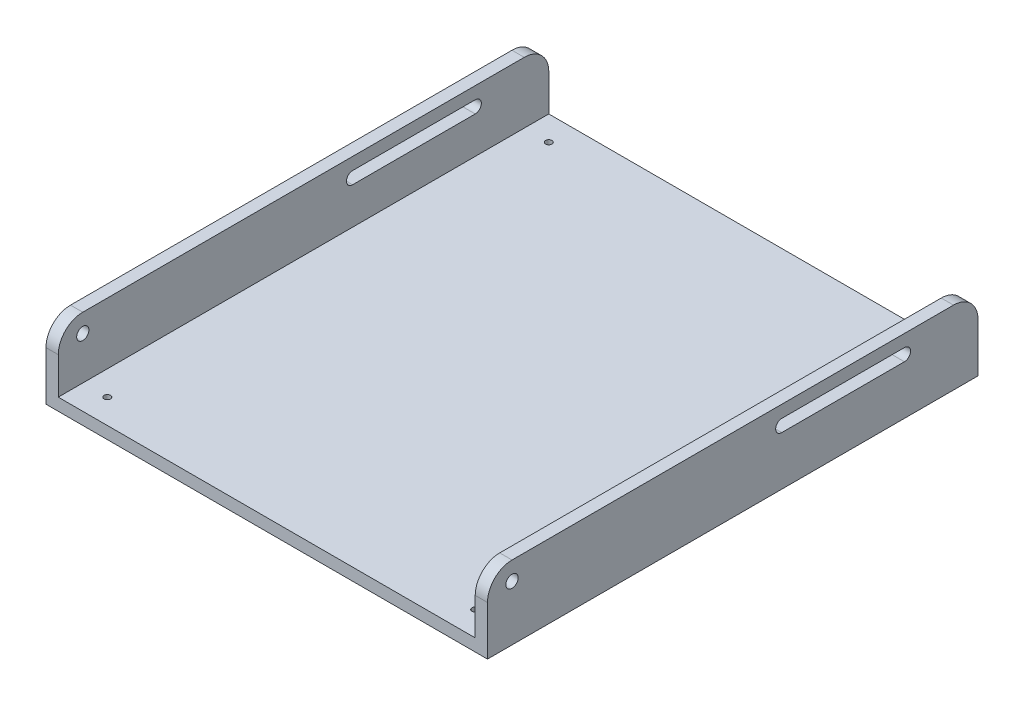
ISO-10303-21;
HEADER;
FILE_DESCRIPTION(('STEP AP214'),'2;1');
FILE_NAME('part.step','',(''),(''),'','','');
FILE_SCHEMA(('AUTOMOTIVE_DESIGN { 1 0 10303 214 1 1 1 1 }'));
ENDSEC;
DATA;
#1=APPLICATION_CONTEXT('core data for automotive mechanical design processes');
#2=APPLICATION_PROTOCOL_DEFINITION('international standard','automotive_design',2000,#1);
#3=PRODUCT_CONTEXT('',#1,'mechanical');
#4=PRODUCT('Part','Part','',(#3));
#5=PRODUCT_RELATED_PRODUCT_CATEGORY('part','',(#4));
#6=PRODUCT_DEFINITION_FORMATION('','',#4);
#7=PRODUCT_DEFINITION_CONTEXT('part definition',#1,'design');
#8=PRODUCT_DEFINITION('design','',#6,#7);
#9=PRODUCT_DEFINITION_SHAPE('','',#8);
#10=(LENGTH_UNIT() NAMED_UNIT(*) SI_UNIT(.MILLI.,.METRE.));
#11=(NAMED_UNIT(*) PLANE_ANGLE_UNIT() SI_UNIT($,.RADIAN.));
#12=(NAMED_UNIT(*) SI_UNIT($,.STERADIAN.) SOLID_ANGLE_UNIT());
#13=UNCERTAINTY_MEASURE_WITH_UNIT(LENGTH_MEASURE(1.E-05),#10,'distance_accuracy_value','');
#14=(GEOMETRIC_REPRESENTATION_CONTEXT(3) GLOBAL_UNCERTAINTY_ASSIGNED_CONTEXT((#13)) GLOBAL_UNIT_ASSIGNED_CONTEXT((#10,
#11,#12)) REPRESENTATION_CONTEXT('',''));
#15=CARTESIAN_POINT('',(0.,0.,0.));
#16=DIRECTION('',(0.,0.,1.));
#17=DIRECTION('',(1.,0.,0.));
#18=AXIS2_PLACEMENT_3D('',#15,#16,#17);
#19=CARTESIAN_POINT('',(-140.,0.,200.));
#20=DIRECTION('',(-1.,0.,0.));
#21=DIRECTION('',(0.,0.,1.));
#22=AXIS2_PLACEMENT_3D('',#19,#20,#21);
#23=PLANE('',#22);
#24=CARTESIAN_POINT('',(-140.,45.,180.));
#25=DIRECTION('',(-1.,0.,0.));
#26=DIRECTION('',(0.,0.,1.));
#27=AXIS2_PLACEMENT_3D('',#24,#25,#26);
#28=CIRCLE('',#27,4.99999999999999);
#29=CARTESIAN_POINT('',(-140.,45.,185.));
#30=VERTEX_POINT('',#29);
#31=EDGE_CURVE('E299',#30,#30,#28,.T.);
#32=ORIENTED_EDGE('',*,*,#31,.T.);
#33=EDGE_LOOP('',(#32));
#34=FACE_BOUND('',#33,.T.);
#35=DIRECTION('',(0.,0.,1.));
#36=VECTOR('',#35,1.);
#37=CARTESIAN_POINT('',(-140.,40.,200.));
#38=LINE('',#37,#36);
#39=CARTESIAN_POINT('',(-140.,40.,-140.));
#40=VERTEX_POINT('',#39);
#41=CARTESIAN_POINT('',(-140.,40.,-40.));
#42=VERTEX_POINT('',#41);
#43=EDGE_CURVE('E216',#40,#42,#38,.T.);
#44=ORIENTED_EDGE('',*,*,#43,.T.);
#45=CARTESIAN_POINT('',(-140.,45.,-40.));
#46=DIRECTION('',(-1.,0.,0.));
#47=DIRECTION('',(0.,0.,1.));
#48=AXIS2_PLACEMENT_3D('',#45,#46,#47);
#49=CIRCLE('',#48,5.);
#50=CARTESIAN_POINT('',(-140.,50.,-40.));
#51=VERTEX_POINT('',#50);
#52=EDGE_CURVE('E232',#42,#51,#49,.T.);
#53=ORIENTED_EDGE('',*,*,#52,.T.);
#54=DIRECTION('',(0.,0.,-1.));
#55=VECTOR('',#54,1.);
#56=CARTESIAN_POINT('',(-140.,50.,200.));
#57=LINE('',#56,#55);
#58=CARTESIAN_POINT('',(-140.,50.,-140.));
#59=VERTEX_POINT('',#58);
#60=EDGE_CURVE('E227',#51,#59,#57,.T.);
#61=ORIENTED_EDGE('',*,*,#60,.T.);
#62=CARTESIAN_POINT('',(-140.,45.,-140.));
#63=DIRECTION('',(-1.,0.,0.));
#64=DIRECTION('',(0.,0.,1.));
#65=AXIS2_PLACEMENT_3D('',#62,#63,#64);
#66=CIRCLE('',#65,4.99999999999999);
#67=EDGE_CURVE('E222',#59,#40,#66,.T.);
#68=ORIENTED_EDGE('',*,*,#67,.T.);
#69=EDGE_LOOP('',(#44,#53,#61,#68));
#70=FACE_BOUND('',#69,.T.);
#71=DIRECTION('',(0.,0.,-1.));
#72=VECTOR('',#71,1.);
#73=CARTESIAN_POINT('',(-140.,60.,200.));
#74=LINE('',#73,#72);
#75=CARTESIAN_POINT('',(-140.,60.,180.));
#76=VERTEX_POINT('',#75);
#77=CARTESIAN_POINT('',(-140.,60.,-180.));
#78=VERTEX_POINT('',#77);
#79=EDGE_CURVE('E283',#76,#78,#74,.T.);
#80=ORIENTED_EDGE('',*,*,#79,.F.);
#81=CARTESIAN_POINT('',(-140.,40.,180.));
#82=DIRECTION('',(-1.,0.,0.));
#83=DIRECTION('',(0.,0.,1.));
#84=AXIS2_PLACEMENT_3D('',#81,#82,#83);
#85=CIRCLE('',#84,20.);
#86=CARTESIAN_POINT('',(-140.,40.,200.));
#87=VERTEX_POINT('',#86);
#88=EDGE_CURVE('E323',#76,#87,#85,.F.);
#89=ORIENTED_EDGE('',*,*,#88,.T.);
#90=DIRECTION('',(0.,1.,0.));
#91=VECTOR('',#90,1.);
#92=CARTESIAN_POINT('',(-140.,0.,200.));
#93=LINE('',#92,#91);
#94=CARTESIAN_POINT('',(-140.,10.,200.));
#95=VERTEX_POINT('',#94);
#96=EDGE_CURVE('E236',#95,#87,#93,.T.);
#97=ORIENTED_EDGE('',*,*,#96,.F.);
#98=DIRECTION('',(0.,0.,-1.));
#99=VECTOR('',#98,1.);
#100=CARTESIAN_POINT('',(-140.,10.,200.));
#101=LINE('',#100,#99);
#102=CARTESIAN_POINT('',(-140.,10.,-200.));
#103=VERTEX_POINT('',#102);
#104=EDGE_CURVE('E252',#95,#103,#101,.T.);
#105=ORIENTED_EDGE('',*,*,#104,.T.);
#106=DIRECTION('',(0.,1.,0.));
#107=VECTOR('',#106,1.);
#108=CARTESIAN_POINT('',(-140.,0.,-200.));
#109=LINE('',#108,#107);
#110=CARTESIAN_POINT('',(-140.,40.,-200.));
#111=VERTEX_POINT('',#110);
#112=EDGE_CURVE('E235',#103,#111,#109,.T.);
#113=ORIENTED_EDGE('',*,*,#112,.T.);
#114=CARTESIAN_POINT('',(-140.,40.,-180.));
#115=DIRECTION('',(-1.,0.,0.));
#116=DIRECTION('',(0.,0.,1.));
#117=AXIS2_PLACEMENT_3D('',#114,#115,#116);
#118=CIRCLE('',#117,20.);
#119=EDGE_CURVE('E59',#111,#78,#118,.F.);
#120=ORIENTED_EDGE('',*,*,#119,.T.);
#121=EDGE_LOOP('',(#80,#89,#97,#105,#113,#120));
#122=FACE_BOUND('',#121,.T.);
#123=ADVANCED_FACE('F36',(#34,#70,#122),#23,.F.);
#124=CARTESIAN_POINT('',(-150.,60.,200.));
#125=DIRECTION('',(0.,1.,0.));
#126=DIRECTION('',(0.,0.,1.));
#127=AXIS2_PLACEMENT_3D('',#124,#125,#126);
#128=PLANE('',#127);
#129=DIRECTION('',(0.,0.,-1.));
#130=VECTOR('',#129,1.);
#131=CARTESIAN_POINT('',(-150.,60.,200.));
#132=LINE('',#131,#130);
#133=CARTESIAN_POINT('',(-150.,60.,180.));
#134=VERTEX_POINT('',#133);
#135=CARTESIAN_POINT('',(-150.,60.,-180.));
#136=VERTEX_POINT('',#135);
#137=EDGE_CURVE('E281',#134,#136,#132,.T.);
#138=ORIENTED_EDGE('',*,*,#137,.F.);
#139=DIRECTION('',(1.,0.,0.));
#140=VECTOR('',#139,1.);
#141=CARTESIAN_POINT('',(-140.,60.,180.));
#142=LINE('',#141,#140);
#143=EDGE_CURVE('E319',#134,#76,#142,.T.);
#144=ORIENTED_EDGE('',*,*,#143,.T.);
#145=ORIENTED_EDGE('',*,*,#79,.T.);
#146=DIRECTION('',(1.,0.,0.));
#147=VECTOR('',#146,1.);
#148=CARTESIAN_POINT('',(-150.,60.,-180.));
#149=LINE('',#148,#147);
#150=EDGE_CURVE('E317',#78,#136,#149,.F.);
#151=ORIENTED_EDGE('',*,*,#150,.T.);
#152=EDGE_LOOP('',(#138,#144,#145,#151));
#153=FACE_BOUND('',#152,.T.);
#154=ADVANCED_FACE('F347',(#153),#128,.T.);
#155=CARTESIAN_POINT('',(-150.,0.,200.));
#156=DIRECTION('',(-1.,0.,0.));
#157=DIRECTION('',(0.,0.,1.));
#158=AXIS2_PLACEMENT_3D('',#155,#156,#157);
#159=PLANE('',#158);
#160=CARTESIAN_POINT('',(-150.,45.,180.));
#161=DIRECTION('',(-1.,0.,0.));
#162=DIRECTION('',(0.,0.,1.));
#163=AXIS2_PLACEMENT_3D('',#160,#161,#162);
#164=CIRCLE('',#163,4.99999999999999);
#165=CARTESIAN_POINT('',(-150.,45.,185.));
#166=VERTEX_POINT('',#165);
#167=EDGE_CURVE('E482',#166,#166,#164,.T.);
#168=ORIENTED_EDGE('',*,*,#167,.F.);
#169=EDGE_LOOP('',(#168));
#170=FACE_BOUND('',#169,.T.);
#171=CARTESIAN_POINT('',(-150.,45.,-40.));
#172=DIRECTION('',(-1.,0.,0.));
#173=DIRECTION('',(0.,0.,1.));
#174=AXIS2_PLACEMENT_3D('',#171,#172,#173);
#175=CIRCLE('',#174,5.);
#176=CARTESIAN_POINT('',(-150.,40.,-40.));
#177=VERTEX_POINT('',#176);
#178=CARTESIAN_POINT('',(-150.,50.,-40.));
#179=VERTEX_POINT('',#178);
#180=EDGE_CURVE('E230',#177,#179,#175,.T.);
#181=ORIENTED_EDGE('',*,*,#180,.F.);
#182=DIRECTION('',(0.,0.,1.));
#183=VECTOR('',#182,1.);
#184=CARTESIAN_POINT('',(-150.,40.,200.));
#185=LINE('',#184,#183);
#186=CARTESIAN_POINT('',(-150.,40.,-140.));
#187=VERTEX_POINT('',#186);
#188=EDGE_CURVE('E214',#187,#177,#185,.T.);
#189=ORIENTED_EDGE('',*,*,#188,.F.);
#190=CARTESIAN_POINT('',(-150.,45.,-140.));
#191=DIRECTION('',(-1.,0.,0.));
#192=DIRECTION('',(0.,0.,1.));
#193=AXIS2_PLACEMENT_3D('',#190,#191,#192);
#194=CIRCLE('',#193,4.99999999999999);
#195=CARTESIAN_POINT('',(-150.,50.,-140.));
#196=VERTEX_POINT('',#195);
#197=EDGE_CURVE('E219',#196,#187,#194,.T.);
#198=ORIENTED_EDGE('',*,*,#197,.F.);
#199=DIRECTION('',(0.,0.,-1.));
#200=VECTOR('',#199,1.);
#201=CARTESIAN_POINT('',(-150.,50.,200.));
#202=LINE('',#201,#200);
#203=EDGE_CURVE('E225',#179,#196,#202,.T.);
#204=ORIENTED_EDGE('',*,*,#203,.F.);
#205=EDGE_LOOP('',(#181,#189,#198,#204));
#206=FACE_BOUND('',#205,.T.);
#207=DIRECTION('',(0.,1.,0.));
#208=VECTOR('',#207,1.);
#209=CARTESIAN_POINT('',(-150.,0.,200.));
#210=LINE('',#209,#208);
#211=CARTESIAN_POINT('',(-150.,0.,200.));
#212=VERTEX_POINT('',#211);
#213=CARTESIAN_POINT('',(-150.,40.,200.));
#214=VERTEX_POINT('',#213);
#215=EDGE_CURVE('E239',#212,#214,#210,.T.);
#216=ORIENTED_EDGE('',*,*,#215,.T.);
#217=CARTESIAN_POINT('',(-150.,40.,180.));
#218=DIRECTION('',(-1.,0.,0.));
#219=DIRECTION('',(0.,0.,1.));
#220=AXIS2_PLACEMENT_3D('',#217,#218,#219);
#221=CIRCLE('',#220,20.);
#222=EDGE_CURVE('E326',#214,#134,#221,.T.);
#223=ORIENTED_EDGE('',*,*,#222,.T.);
#224=ORIENTED_EDGE('',*,*,#137,.T.);
#225=CARTESIAN_POINT('',(-150.,40.,-180.));
#226=DIRECTION('',(-1.,0.,0.));
#227=DIRECTION('',(0.,0.,1.));
#228=AXIS2_PLACEMENT_3D('',#225,#226,#227);
#229=CIRCLE('',#228,20.);
#230=CARTESIAN_POINT('',(-150.,40.,-200.));
#231=VERTEX_POINT('',#230);
#232=EDGE_CURVE('E51',#136,#231,#229,.T.);
#233=ORIENTED_EDGE('',*,*,#232,.T.);
#234=DIRECTION('',(0.,1.,0.));
#235=VECTOR('',#234,1.);
#236=CARTESIAN_POINT('',(-150.,0.,-200.));
#237=LINE('',#236,#235);
#238=CARTESIAN_POINT('',(-150.,0.,-200.));
#239=VERTEX_POINT('',#238);
#240=EDGE_CURVE('E255',#239,#231,#237,.T.);
#241=ORIENTED_EDGE('',*,*,#240,.F.);
#242=DIRECTION('',(0.,0.,-1.));
#243=VECTOR('',#242,1.);
#244=CARTESIAN_POINT('',(-150.,0.,200.));
#245=LINE('',#244,#243);
#246=EDGE_CURVE('E279',#212,#239,#245,.T.);
#247=ORIENTED_EDGE('',*,*,#246,.F.);
#248=EDGE_LOOP('',(#216,#223,#224,#233,#241,#247));
#249=FACE_BOUND('',#248,.T.);
#250=ADVANCED_FACE('F350',(#170,#206,#249),#159,.T.);
#251=CARTESIAN_POINT('',(-150.,0.,200.));
#252=DIRECTION('',(0.,-1.,0.));
#253=DIRECTION('',(0.,0.,-1.));
#254=AXIS2_PLACEMENT_3D('',#251,#252,#253);
#255=PLANE('',#254);
#256=CARTESIAN_POINT('',(-120.,0.,180.));
#257=DIRECTION('',(0.,-1.,0.));
#258=DIRECTION('',(0.,0.,-1.));
#259=AXIS2_PLACEMENT_3D('',#256,#257,#258);
#260=CIRCLE('',#259,2.59999999999999);
#261=CARTESIAN_POINT('',(-120.,0.,177.4));
#262=VERTEX_POINT('',#261);
#263=EDGE_CURVE('E457',#262,#262,#260,.T.);
#264=ORIENTED_EDGE('',*,*,#263,.F.);
#265=EDGE_LOOP('',(#264));
#266=FACE_BOUND('',#265,.T.);
#267=CARTESIAN_POINT('',(180.,0.,180.));
#268=DIRECTION('',(0.,-1.,0.));
#269=DIRECTION('',(0.,0.,-1.));
#270=AXIS2_PLACEMENT_3D('',#267,#268,#269);
#271=CIRCLE('',#270,2.59999999999999);
#272=CARTESIAN_POINT('',(180.,0.,177.4));
#273=VERTEX_POINT('',#272);
#274=EDGE_CURVE('E467',#273,#273,#271,.T.);
#275=ORIENTED_EDGE('',*,*,#274,.F.);
#276=EDGE_LOOP('',(#275));
#277=FACE_BOUND('',#276,.T.);
#278=CARTESIAN_POINT('',(180.,0.,-180.));
#279=DIRECTION('',(0.,-1.,0.));
#280=DIRECTION('',(0.,0.,-1.));
#281=AXIS2_PLACEMENT_3D('',#278,#279,#280);
#282=CIRCLE('',#281,2.59999999999999);
#283=CARTESIAN_POINT('',(180.,0.,-182.6));
#284=VERTEX_POINT('',#283);
#285=EDGE_CURVE('E473',#284,#284,#282,.T.);
#286=ORIENTED_EDGE('',*,*,#285,.F.);
#287=EDGE_LOOP('',(#286));
#288=FACE_BOUND('',#287,.T.);
#289=CARTESIAN_POINT('',(-120.,0.,-180.));
#290=DIRECTION('',(0.,-1.,0.));
#291=DIRECTION('',(0.,0.,-1.));
#292=AXIS2_PLACEMENT_3D('',#289,#290,#291);
#293=CIRCLE('',#292,2.59999999999999);
#294=CARTESIAN_POINT('',(-120.,0.,-182.6));
#295=VERTEX_POINT('',#294);
#296=EDGE_CURVE('E479',#295,#295,#293,.T.);
#297=ORIENTED_EDGE('',*,*,#296,.F.);
#298=EDGE_LOOP('',(#297));
#299=FACE_BOUND('',#298,.T.);
#300=DIRECTION('',(-1.,0.,0.));
#301=VECTOR('',#300,1.);
#302=CARTESIAN_POINT('',(-150.,0.,-200.));
#303=LINE('',#302,#301);
#304=CARTESIAN_POINT('',(210.,0.,-200.));
#305=VERTEX_POINT('',#304);
#306=EDGE_CURVE('E257',#305,#239,#303,.T.);
#307=ORIENTED_EDGE('',*,*,#306,.F.);
#308=DIRECTION('',(0.,0.,-1.));
#309=VECTOR('',#308,1.);
#310=CARTESIAN_POINT('',(210.,0.,200.));
#311=LINE('',#310,#309);
#312=CARTESIAN_POINT('',(210.,0.,200.));
#313=VERTEX_POINT('',#312);
#314=EDGE_CURVE('E276',#313,#305,#311,.T.);
#315=ORIENTED_EDGE('',*,*,#314,.F.);
#316=DIRECTION('',(-1.,0.,0.));
#317=VECTOR('',#316,1.);
#318=CARTESIAN_POINT('',(-150.,0.,200.));
#319=LINE('',#318,#317);
#320=EDGE_CURVE('E243',#313,#212,#319,.T.);
#321=ORIENTED_EDGE('',*,*,#320,.T.);
#322=ORIENTED_EDGE('',*,*,#246,.T.);
#323=EDGE_LOOP('',(#307,#315,#321,#322));
#324=FACE_BOUND('',#323,.T.);
#325=ADVANCED_FACE('F342',(#266,#277,#288,#299,#324),#255,.T.);
#326=CARTESIAN_POINT('',(210.,0.,200.));
#327=DIRECTION('',(1.,0.,0.));
#328=DIRECTION('',(0.,0.,-1.));
#329=AXIS2_PLACEMENT_3D('',#326,#327,#328);
#330=PLANE('',#329);
#331=CARTESIAN_POINT('',(210.,45.,180.));
#332=DIRECTION('',(-1.,0.,0.));
#333=DIRECTION('',(0.,0.,1.));
#334=AXIS2_PLACEMENT_3D('',#331,#332,#333);
#335=CIRCLE('',#334,4.99999999999999);
#336=CARTESIAN_POINT('',(210.,45.,185.));
#337=VERTEX_POINT('',#336);
#338=EDGE_CURVE('E300',#337,#337,#335,.T.);
#339=ORIENTED_EDGE('',*,*,#338,.T.);
#340=EDGE_LOOP('',(#339));
#341=FACE_BOUND('',#340,.T.);
#342=CARTESIAN_POINT('',(210.,45.,-40.));
#343=DIRECTION('',(1.,0.,0.));
#344=DIRECTION('',(0.,0.,-1.));
#345=AXIS2_PLACEMENT_3D('',#342,#343,#344);
#346=CIRCLE('',#345,5.);
#347=CARTESIAN_POINT('',(210.,50.,-40.));
#348=VERTEX_POINT('',#347);
#349=CARTESIAN_POINT('',(210.,40.,-40.));
#350=VERTEX_POINT('',#349);
#351=EDGE_CURVE('E197',#348,#350,#346,.T.);
#352=ORIENTED_EDGE('',*,*,#351,.F.);
#353=DIRECTION('',(0.,0.,1.));
#354=VECTOR('',#353,1.);
#355=CARTESIAN_POINT('',(210.,50.,-40.));
#356=LINE('',#355,#354);
#357=CARTESIAN_POINT('',(210.,50.,-140.));
#358=VERTEX_POINT('',#357);
#359=EDGE_CURVE('E202',#358,#348,#356,.T.);
#360=ORIENTED_EDGE('',*,*,#359,.F.);
#361=CARTESIAN_POINT('',(210.,45.,-140.));
#362=DIRECTION('',(1.,0.,0.));
#363=DIRECTION('',(0.,0.,-1.));
#364=AXIS2_PLACEMENT_3D('',#361,#362,#363);
#365=CIRCLE('',#364,4.99999999999999);
#366=CARTESIAN_POINT('',(210.,40.,-140.));
#367=VERTEX_POINT('',#366);
#368=EDGE_CURVE('E180',#367,#358,#365,.T.);
#369=ORIENTED_EDGE('',*,*,#368,.F.);
#370=DIRECTION('',(0.,0.,-1.));
#371=VECTOR('',#370,1.);
#372=CARTESIAN_POINT('',(210.,40.,-40.));
#373=LINE('',#372,#371);
#374=EDGE_CURVE('E191',#350,#367,#373,.T.);
#375=ORIENTED_EDGE('',*,*,#374,.F.);
#376=EDGE_LOOP('',(#352,#360,#369,#375));
#377=FACE_BOUND('',#376,.T.);
#378=DIRECTION('',(0.,0.,-1.));
#379=VECTOR('',#378,1.);
#380=CARTESIAN_POINT('',(210.,60.,200.));
#381=LINE('',#380,#379);
#382=CARTESIAN_POINT('',(210.,60.,180.));
#383=VERTEX_POINT('',#382);
#384=CARTESIAN_POINT('',(210.,60.,-180.));
#385=VERTEX_POINT('',#384);
#386=EDGE_CURVE('E273',#383,#385,#381,.T.);
#387=ORIENTED_EDGE('',*,*,#386,.F.);
#388=CARTESIAN_POINT('',(210.,40.,180.));
#389=DIRECTION('',(1.,0.,0.));
#390=DIRECTION('',(0.,0.,-1.));
#391=AXIS2_PLACEMENT_3D('',#388,#389,#390);
#392=CIRCLE('',#391,20.);
#393=CARTESIAN_POINT('',(210.,40.,200.));
#394=VERTEX_POINT('',#393);
#395=EDGE_CURVE('E307',#383,#394,#392,.T.);
#396=ORIENTED_EDGE('',*,*,#395,.T.);
#397=DIRECTION('',(0.,-1.,0.));
#398=VECTOR('',#397,1.);
#399=CARTESIAN_POINT('',(210.,0.,200.));
#400=LINE('',#399,#398);
#401=EDGE_CURVE('E246',#394,#313,#400,.T.);
#402=ORIENTED_EDGE('',*,*,#401,.T.);
#403=ORIENTED_EDGE('',*,*,#314,.T.);
#404=DIRECTION('',(0.,-1.,0.));
#405=VECTOR('',#404,1.);
#406=CARTESIAN_POINT('',(210.,0.,-200.));
#407=LINE('',#406,#405);
#408=CARTESIAN_POINT('',(210.,40.,-200.));
#409=VERTEX_POINT('',#408);
#410=EDGE_CURVE('E260',#409,#305,#407,.T.);
#411=ORIENTED_EDGE('',*,*,#410,.F.);
#412=CARTESIAN_POINT('',(210.,40.,-180.));
#413=DIRECTION('',(1.,0.,0.));
#414=DIRECTION('',(0.,0.,-1.));
#415=AXIS2_PLACEMENT_3D('',#412,#413,#414);
#416=CIRCLE('',#415,20.);
#417=EDGE_CURVE('E305',#409,#385,#416,.T.);
#418=ORIENTED_EDGE('',*,*,#417,.T.);
#419=EDGE_LOOP('',(#387,#396,#402,#403,#411,#418));
#420=FACE_BOUND('',#419,.T.);
#421=ADVANCED_FACE('F199',(#341,#377,#420),#330,.T.);
#422=CARTESIAN_POINT('',(200.,60.,200.));
#423=DIRECTION('',(0.,1.,0.));
#424=DIRECTION('',(0.,0.,1.));
#425=AXIS2_PLACEMENT_3D('',#422,#423,#424);
#426=PLANE('',#425);
#427=DIRECTION('',(0.,0.,-1.));
#428=VECTOR('',#427,1.);
#429=CARTESIAN_POINT('',(200.,60.,200.));
#430=LINE('',#429,#428);
#431=CARTESIAN_POINT('',(200.,60.,180.));
#432=VERTEX_POINT('',#431);
#433=CARTESIAN_POINT('',(200.,60.,-180.));
#434=VERTEX_POINT('',#433);
#435=EDGE_CURVE('E270',#432,#434,#430,.T.);
#436=ORIENTED_EDGE('',*,*,#435,.F.);
#437=DIRECTION('',(1.,0.,0.));
#438=VECTOR('',#437,1.);
#439=CARTESIAN_POINT('',(210.,60.,180.));
#440=LINE('',#439,#438);
#441=EDGE_CURVE('E302',#432,#383,#440,.T.);
#442=ORIENTED_EDGE('',*,*,#441,.T.);
#443=ORIENTED_EDGE('',*,*,#386,.T.);
#444=DIRECTION('',(1.,0.,0.));
#445=VECTOR('',#444,1.);
#446=CARTESIAN_POINT('',(200.,60.,-180.));
#447=LINE('',#446,#445);
#448=EDGE_CURVE('E295',#385,#434,#447,.F.);
#449=ORIENTED_EDGE('',*,*,#448,.T.);
#450=EDGE_LOOP('',(#436,#442,#443,#449));
#451=FACE_BOUND('',#450,.T.);
#452=ADVANCED_FACE('F370',(#451),#426,.T.);
#453=CARTESIAN_POINT('',(200.,0.,200.));
#454=DIRECTION('',(1.,0.,0.));
#455=DIRECTION('',(0.,0.,-1.));
#456=AXIS2_PLACEMENT_3D('',#453,#454,#455);
#457=PLANE('',#456);
#458=CARTESIAN_POINT('',(200.,45.,180.));
#459=DIRECTION('',(1.,0.,0.));
#460=DIRECTION('',(0.,0.,-1.));
#461=AXIS2_PLACEMENT_3D('',#458,#459,#460);
#462=CIRCLE('',#461,4.99999999999999);
#463=CARTESIAN_POINT('',(200.,45.,185.));
#464=VERTEX_POINT('',#463);
#465=EDGE_CURVE('E296',#464,#464,#462,.T.);
#466=ORIENTED_EDGE('',*,*,#465,.T.);
#467=EDGE_LOOP('',(#466));
#468=FACE_BOUND('',#467,.T.);
#469=DIRECTION('',(0.,0.,1.));
#470=VECTOR('',#469,1.);
#471=CARTESIAN_POINT('',(200.,50.,200.));
#472=LINE('',#471,#470);
#473=CARTESIAN_POINT('',(200.,50.,-140.));
#474=VERTEX_POINT('',#473);
#475=CARTESIAN_POINT('',(200.,50.,-40.));
#476=VERTEX_POINT('',#475);
#477=EDGE_CURVE('E289',#474,#476,#472,.T.);
#478=ORIENTED_EDGE('',*,*,#477,.T.);
#479=CARTESIAN_POINT('',(200.,45.,-40.));
#480=DIRECTION('',(1.,0.,0.));
#481=DIRECTION('',(0.,0.,-1.));
#482=AXIS2_PLACEMENT_3D('',#479,#480,#481);
#483=CIRCLE('',#482,5.);
#484=CARTESIAN_POINT('',(200.,40.,-40.));
#485=VERTEX_POINT('',#484);
#486=EDGE_CURVE('E292',#476,#485,#483,.T.);
#487=ORIENTED_EDGE('',*,*,#486,.T.);
#488=DIRECTION('',(0.,0.,-1.));
#489=VECTOR('',#488,1.);
#490=CARTESIAN_POINT('',(200.,40.,200.));
#491=LINE('',#490,#489);
#492=CARTESIAN_POINT('',(200.,40.,-140.));
#493=VERTEX_POINT('',#492);
#494=EDGE_CURVE('E286',#485,#493,#491,.T.);
#495=ORIENTED_EDGE('',*,*,#494,.T.);
#496=CARTESIAN_POINT('',(200.,45.,-140.));
#497=DIRECTION('',(1.,0.,0.));
#498=DIRECTION('',(0.,0.,-1.));
#499=AXIS2_PLACEMENT_3D('',#496,#497,#498);
#500=CIRCLE('',#499,4.99999999999999);
#501=EDGE_CURVE('E183',#493,#474,#500,.T.);
#502=ORIENTED_EDGE('',*,*,#501,.T.);
#503=EDGE_LOOP('',(#478,#487,#495,#502));
#504=FACE_BOUND('',#503,.T.);
#505=DIRECTION('',(0.,1.,0.));
#506=VECTOR('',#505,1.);
#507=CARTESIAN_POINT('',(200.,0.,200.));
#508=LINE('',#507,#506);
#509=CARTESIAN_POINT('',(200.,40.,200.));
#510=VERTEX_POINT('',#509);
#511=CARTESIAN_POINT('',(200.,10.,200.));
#512=VERTEX_POINT('',#511);
#513=EDGE_CURVE('E248',#510,#512,#508,.F.);
#514=ORIENTED_EDGE('',*,*,#513,.F.);
#515=CARTESIAN_POINT('',(200.,40.,180.));
#516=DIRECTION('',(1.,0.,0.));
#517=DIRECTION('',(0.,0.,-1.));
#518=AXIS2_PLACEMENT_3D('',#515,#516,#517);
#519=CIRCLE('',#518,20.);
#520=EDGE_CURVE('E315',#510,#432,#519,.F.);
#521=ORIENTED_EDGE('',*,*,#520,.T.);
#522=ORIENTED_EDGE('',*,*,#435,.T.);
#523=CARTESIAN_POINT('',(200.,40.,-180.));
#524=DIRECTION('',(1.,0.,0.));
#525=DIRECTION('',(0.,0.,-1.));
#526=AXIS2_PLACEMENT_3D('',#523,#524,#525);
#527=CIRCLE('',#526,20.);
#528=CARTESIAN_POINT('',(200.,40.,-200.));
#529=VERTEX_POINT('',#528);
#530=EDGE_CURVE('E313',#434,#529,#527,.F.);
#531=ORIENTED_EDGE('',*,*,#530,.T.);
#532=DIRECTION('',(0.,1.,0.));
#533=VECTOR('',#532,1.);
#534=CARTESIAN_POINT('',(200.,0.,-200.));
#535=LINE('',#534,#533);
#536=CARTESIAN_POINT('',(200.,10.,-200.));
#537=VERTEX_POINT('',#536);
#538=EDGE_CURVE('E262',#529,#537,#535,.F.);
#539=ORIENTED_EDGE('',*,*,#538,.T.);
#540=DIRECTION('',(0.,0.,-1.));
#541=VECTOR('',#540,1.);
#542=CARTESIAN_POINT('',(200.,10.,200.));
#543=LINE('',#542,#541);
#544=EDGE_CURVE('E267',#512,#537,#543,.T.);
#545=ORIENTED_EDGE('',*,*,#544,.F.);
#546=EDGE_LOOP('',(#514,#521,#522,#531,#539,#545));
#547=FACE_BOUND('',#546,.T.);
#548=ADVANCED_FACE('F365',(#468,#504,#547),#457,.F.);
#549=CARTESIAN_POINT('',(-150.,10.,200.));
#550=DIRECTION('',(0.,-1.,0.));
#551=DIRECTION('',(0.,0.,-1.));
#552=AXIS2_PLACEMENT_3D('',#549,#550,#551);
#553=PLANE('',#552);
#554=CARTESIAN_POINT('',(-120.,10.,180.));
#555=DIRECTION('',(0.,1.,0.));
#556=DIRECTION('',(0.,0.,1.));
#557=AXIS2_PLACEMENT_3D('',#554,#555,#556);
#558=CIRCLE('',#557,2.59999999999999);
#559=CARTESIAN_POINT('',(-120.,10.,182.6));
#560=VERTEX_POINT('',#559);
#561=EDGE_CURVE('E460',#560,#560,#558,.T.);
#562=ORIENTED_EDGE('',*,*,#561,.F.);
#563=EDGE_LOOP('',(#562));
#564=FACE_BOUND('',#563,.T.);
#565=CARTESIAN_POINT('',(180.,10.,180.));
#566=DIRECTION('',(0.,1.,0.));
#567=DIRECTION('',(0.,0.,1.));
#568=AXIS2_PLACEMENT_3D('',#565,#566,#567);
#569=CIRCLE('',#568,2.59999999999999);
#570=CARTESIAN_POINT('',(180.,10.,182.6));
#571=VERTEX_POINT('',#570);
#572=EDGE_CURVE('E462',#571,#571,#569,.T.);
#573=ORIENTED_EDGE('',*,*,#572,.F.);
#574=EDGE_LOOP('',(#573));
#575=FACE_BOUND('',#574,.T.);
#576=CARTESIAN_POINT('',(180.,10.,-180.));
#577=DIRECTION('',(0.,1.,0.));
#578=DIRECTION('',(0.,0.,1.));
#579=AXIS2_PLACEMENT_3D('',#576,#577,#578);
#580=CIRCLE('',#579,2.59999999999999);
#581=CARTESIAN_POINT('',(180.,10.,-177.4));
#582=VERTEX_POINT('',#581);
#583=EDGE_CURVE('E470',#582,#582,#580,.T.);
#584=ORIENTED_EDGE('',*,*,#583,.F.);
#585=EDGE_LOOP('',(#584));
#586=FACE_BOUND('',#585,.T.);
#587=CARTESIAN_POINT('',(-120.,10.,-180.));
#588=DIRECTION('',(0.,1.,0.));
#589=DIRECTION('',(0.,0.,1.));
#590=AXIS2_PLACEMENT_3D('',#587,#588,#589);
#591=CIRCLE('',#590,2.59999999999999);
#592=CARTESIAN_POINT('',(-120.,10.,-177.4));
#593=VERTEX_POINT('',#592);
#594=EDGE_CURVE('E476',#593,#593,#591,.T.);
#595=ORIENTED_EDGE('',*,*,#594,.F.);
#596=EDGE_LOOP('',(#595));
#597=FACE_BOUND('',#596,.T.);
#598=DIRECTION('',(1.,0.,0.));
#599=VECTOR('',#598,1.);
#600=CARTESIAN_POINT('',(-150.,10.,-200.));
#601=LINE('',#600,#599);
#602=EDGE_CURVE('E240',#537,#103,#601,.F.);
#603=ORIENTED_EDGE('',*,*,#602,.T.);
#604=ORIENTED_EDGE('',*,*,#104,.F.);
#605=DIRECTION('',(1.,0.,0.));
#606=VECTOR('',#605,1.);
#607=CARTESIAN_POINT('',(-150.,10.,200.));
#608=LINE('',#607,#606);
#609=EDGE_CURVE('E250',#512,#95,#608,.F.);
#610=ORIENTED_EDGE('',*,*,#609,.F.);
#611=ORIENTED_EDGE('',*,*,#544,.T.);
#612=EDGE_LOOP('',(#603,#604,#610,#611));
#613=FACE_BOUND('',#612,.T.);
#614=ADVANCED_FACE('F360',(#564,#575,#586,#597,#613),#553,.F.);
#615=CARTESIAN_POINT('',(0.,0.,200.));
#616=DIRECTION('',(0.,0.,-1.));
#617=DIRECTION('',(-1.,0.,0.));
#618=AXIS2_PLACEMENT_3D('',#615,#616,#617);
#619=PLANE('',#618);
#620=ORIENTED_EDGE('',*,*,#401,.F.);
#621=DIRECTION('',(1.,0.,0.));
#622=VECTOR('',#621,1.);
#623=CARTESIAN_POINT('',(200.,40.,200.));
#624=LINE('',#623,#622);
#625=EDGE_CURVE('E311',#394,#510,#624,.F.);
#626=ORIENTED_EDGE('',*,*,#625,.T.);
#627=ORIENTED_EDGE('',*,*,#513,.T.);
#628=ORIENTED_EDGE('',*,*,#609,.T.);
#629=ORIENTED_EDGE('',*,*,#96,.T.);
#630=DIRECTION('',(1.,0.,0.));
#631=VECTOR('',#630,1.);
#632=CARTESIAN_POINT('',(-150.,40.,200.));
#633=LINE('',#632,#631);
#634=EDGE_CURVE('E309',#87,#214,#633,.F.);
#635=ORIENTED_EDGE('',*,*,#634,.T.);
#636=ORIENTED_EDGE('',*,*,#215,.F.);
#637=ORIENTED_EDGE('',*,*,#320,.F.);
#638=EDGE_LOOP('',(#620,#626,#627,#628,#629,#635,#636,#637));
#639=FACE_BOUND('',#638,.T.);
#640=ADVANCED_FACE('F375',(#639),#619,.F.);
#641=CARTESIAN_POINT('',(0.,0.,-200.));
#642=DIRECTION('',(0.,0.,-1.));
#643=DIRECTION('',(-1.,0.,0.));
#644=AXIS2_PLACEMENT_3D('',#641,#642,#643);
#645=PLANE('',#644);
#646=ORIENTED_EDGE('',*,*,#240,.T.);
#647=DIRECTION('',(1.,0.,0.));
#648=VECTOR('',#647,1.);
#649=CARTESIAN_POINT('',(0.,40.,-200.));
#650=LINE('',#649,#648);
#651=EDGE_CURVE('E11',#231,#111,#650,.T.);
#652=ORIENTED_EDGE('',*,*,#651,.T.);
#653=ORIENTED_EDGE('',*,*,#112,.F.);
#654=ORIENTED_EDGE('',*,*,#602,.F.);
#655=ORIENTED_EDGE('',*,*,#538,.F.);
#656=DIRECTION('',(1.,0.,0.));
#657=VECTOR('',#656,1.);
#658=CARTESIAN_POINT('',(0.,40.,-200.));
#659=LINE('',#658,#657);
#660=EDGE_CURVE('E44',#529,#409,#659,.T.);
#661=ORIENTED_EDGE('',*,*,#660,.T.);
#662=ORIENTED_EDGE('',*,*,#410,.T.);
#663=ORIENTED_EDGE('',*,*,#306,.T.);
#664=EDGE_LOOP('',(#646,#652,#653,#654,#655,#661,#662,#663));
#665=FACE_BOUND('',#664,.T.);
#666=ADVANCED_FACE('F332',(#665),#645,.T.);
#667=CARTESIAN_POINT('',(-154.,40.,-40.));
#668=DIRECTION('',(0.,-1.,0.));
#669=DIRECTION('',(0.,0.,-1.));
#670=AXIS2_PLACEMENT_3D('',#667,#668,#669);
#671=PLANE('',#670);
#672=DIRECTION('',(1.,0.,0.));
#673=VECTOR('',#672,1.);
#674=CARTESIAN_POINT('',(-154.,40.,-40.));
#675=LINE('',#674,#673);
#676=EDGE_CURVE('E194',#485,#350,#675,.T.);
#677=ORIENTED_EDGE('',*,*,#676,.T.);
#678=ORIENTED_EDGE('',*,*,#374,.T.);
#679=DIRECTION('',(1.,0.,0.));
#680=VECTOR('',#679,1.);
#681=CARTESIAN_POINT('',(-154.,40.,-140.));
#682=LINE('',#681,#680);
#683=EDGE_CURVE('E175',#493,#367,#682,.T.);
#684=ORIENTED_EDGE('',*,*,#683,.F.);
#685=ORIENTED_EDGE('',*,*,#494,.F.);
#686=EDGE_LOOP('',(#677,#678,#684,#685));
#687=FACE_BOUND('',#686,.T.);
#688=ADVANCED_FACE('F192',(#687),#671,.F.);
#689=CARTESIAN_POINT('',(-154.,45.,-140.));
#690=DIRECTION('',(1.,0.,0.));
#691=DIRECTION('',(0.,0.,-1.));
#692=AXIS2_PLACEMENT_3D('',#689,#690,#691);
#693=CYLINDRICAL_SURFACE('',#692,4.99999999999999);
#694=ORIENTED_EDGE('',*,*,#683,.T.);
#695=ORIENTED_EDGE('',*,*,#368,.T.);
#696=DIRECTION('',(1.,0.,0.));
#697=VECTOR('',#696,1.);
#698=CARTESIAN_POINT('',(-154.,50.,-140.));
#699=LINE('',#698,#697);
#700=EDGE_CURVE('E211',#474,#358,#699,.T.);
#701=ORIENTED_EDGE('',*,*,#700,.F.);
#702=ORIENTED_EDGE('',*,*,#501,.F.);
#703=EDGE_LOOP('',(#694,#695,#701,#702));
#704=FACE_BOUND('',#703,.T.);
#705=ADVANCED_FACE('F177',(#704),#693,.F.);
#706=CARTESIAN_POINT('',(-154.,50.,-40.));
#707=DIRECTION('',(0.,1.,0.));
#708=DIRECTION('',(0.,0.,1.));
#709=AXIS2_PLACEMENT_3D('',#706,#707,#708);
#710=PLANE('',#709);
#711=ORIENTED_EDGE('',*,*,#700,.T.);
#712=ORIENTED_EDGE('',*,*,#359,.T.);
#713=DIRECTION('',(1.,0.,0.));
#714=VECTOR('',#713,1.);
#715=CARTESIAN_POINT('',(-154.,50.,-40.));
#716=LINE('',#715,#714);
#717=EDGE_CURVE('E207',#476,#348,#716,.T.);
#718=ORIENTED_EDGE('',*,*,#717,.F.);
#719=ORIENTED_EDGE('',*,*,#477,.F.);
#720=EDGE_LOOP('',(#711,#712,#718,#719));
#721=FACE_BOUND('',#720,.T.);
#722=ADVANCED_FACE('F435',(#721),#710,.F.);
#723=CARTESIAN_POINT('',(-154.,45.,-40.));
#724=DIRECTION('',(1.,0.,0.));
#725=DIRECTION('',(0.,0.,-1.));
#726=AXIS2_PLACEMENT_3D('',#723,#724,#725);
#727=CYLINDRICAL_SURFACE('',#726,5.);
#728=ORIENTED_EDGE('',*,*,#717,.T.);
#729=ORIENTED_EDGE('',*,*,#351,.T.);
#730=ORIENTED_EDGE('',*,*,#676,.F.);
#731=ORIENTED_EDGE('',*,*,#486,.F.);
#732=EDGE_LOOP('',(#728,#729,#730,#731));
#733=FACE_BOUND('',#732,.T.);
#734=ADVANCED_FACE('F423',(#733),#727,.F.);
#735=EDGE_CURVE('E187',#177,#42,#675,.T.);
#736=ORIENTED_EDGE('',*,*,#735,.F.);
#737=ORIENTED_EDGE('',*,*,#180,.T.);
#738=EDGE_CURVE('E209',#179,#51,#716,.T.);
#739=ORIENTED_EDGE('',*,*,#738,.T.);
#740=ORIENTED_EDGE('',*,*,#52,.F.);
#741=EDGE_LOOP('',(#736,#737,#739,#740));
#742=FACE_BOUND('',#741,.T.);
#743=ADVANCED_FACE('F419',(#742),#727,.F.);
#744=ORIENTED_EDGE('',*,*,#738,.F.);
#745=ORIENTED_EDGE('',*,*,#203,.T.);
#746=EDGE_CURVE('E210',#196,#59,#699,.T.);
#747=ORIENTED_EDGE('',*,*,#746,.T.);
#748=ORIENTED_EDGE('',*,*,#60,.F.);
#749=EDGE_LOOP('',(#744,#745,#747,#748));
#750=FACE_BOUND('',#749,.T.);
#751=ADVANCED_FACE('F422',(#750),#710,.F.);
#752=ORIENTED_EDGE('',*,*,#746,.F.);
#753=ORIENTED_EDGE('',*,*,#197,.T.);
#754=EDGE_CURVE('E186',#187,#40,#682,.T.);
#755=ORIENTED_EDGE('',*,*,#754,.T.);
#756=ORIENTED_EDGE('',*,*,#67,.F.);
#757=EDGE_LOOP('',(#752,#753,#755,#756));
#758=FACE_BOUND('',#757,.T.);
#759=ADVANCED_FACE('F428',(#758),#693,.F.);
#760=ORIENTED_EDGE('',*,*,#754,.F.);
#761=ORIENTED_EDGE('',*,*,#188,.T.);
#762=ORIENTED_EDGE('',*,*,#735,.T.);
#763=ORIENTED_EDGE('',*,*,#43,.F.);
#764=EDGE_LOOP('',(#760,#761,#762,#763));
#765=FACE_BOUND('',#764,.T.);
#766=ADVANCED_FACE('F425',(#765),#671,.F.);
#767=CARTESIAN_POINT('',(210.,45.,180.));
#768=DIRECTION('',(-1.,0.,0.));
#769=DIRECTION('',(0.,0.,1.));
#770=AXIS2_PLACEMENT_3D('',#767,#768,#769);
#771=CYLINDRICAL_SURFACE('',#770,4.99999999999999);
#772=CARTESIAN_POINT('',(210.,45.,185.));
#773=CARTESIAN_POINT('',(209.895833333333,45.,185.));
#774=CARTESIAN_POINT('',(209.791666666667,45.,185.));
#775=CARTESIAN_POINT('',(209.583333333333,45.,185.));
#776=CARTESIAN_POINT('',(209.479166666667,45.,185.));
#777=CARTESIAN_POINT('',(209.270833333333,45.,185.));
#778=CARTESIAN_POINT('',(209.166666666667,45.,185.));
#779=CARTESIAN_POINT('',(208.958333333333,45.,185.));
#780=CARTESIAN_POINT('',(208.854166666667,45.,185.));
#781=CARTESIAN_POINT('',(208.645833333333,45.,185.));
#782=CARTESIAN_POINT('',(208.541666666667,45.,185.));
#783=CARTESIAN_POINT('',(208.333333333333,45.,185.));
#784=CARTESIAN_POINT('',(208.229166666667,45.,185.));
#785=CARTESIAN_POINT('',(208.020833333333,45.,185.));
#786=CARTESIAN_POINT('',(207.916666666667,45.,185.));
#787=CARTESIAN_POINT('',(207.708333333333,45.,185.));
#788=CARTESIAN_POINT('',(207.604166666667,45.,185.));
#789=CARTESIAN_POINT('',(207.395833333333,45.,185.));
#790=CARTESIAN_POINT('',(207.291666666667,45.,185.));
#791=CARTESIAN_POINT('',(207.083333333333,45.,185.));
#792=CARTESIAN_POINT('',(206.979166666667,45.,185.));
#793=CARTESIAN_POINT('',(206.770833333333,45.,185.));
#794=CARTESIAN_POINT('',(206.666666666667,45.,185.));
#795=CARTESIAN_POINT('',(206.458333333333,45.,185.));
#796=CARTESIAN_POINT('',(206.354166666667,45.,185.));
#797=CARTESIAN_POINT('',(206.145833333333,45.,185.));
#798=CARTESIAN_POINT('',(206.041666666667,45.,185.));
#799=CARTESIAN_POINT('',(205.833333333333,45.,185.));
#800=CARTESIAN_POINT('',(205.729166666667,45.,185.));
#801=CARTESIAN_POINT('',(205.520833333333,45.,185.));
#802=CARTESIAN_POINT('',(205.416666666667,45.,185.));
#803=CARTESIAN_POINT('',(205.208333333333,45.,185.));
#804=CARTESIAN_POINT('',(205.104166666667,45.,185.));
#805=CARTESIAN_POINT('',(204.895833333333,45.,185.));
#806=CARTESIAN_POINT('',(204.791666666667,45.,185.));
#807=CARTESIAN_POINT('',(204.583333333333,45.,185.));
#808=CARTESIAN_POINT('',(204.479166666667,45.,185.));
#809=CARTESIAN_POINT('',(204.270833333333,45.,185.));
#810=CARTESIAN_POINT('',(204.166666666667,45.,185.));
#811=CARTESIAN_POINT('',(203.958333333333,45.,185.));
#812=CARTESIAN_POINT('',(203.854166666667,45.,185.));
#813=CARTESIAN_POINT('',(203.645833333333,45.,185.));
#814=CARTESIAN_POINT('',(203.541666666667,45.,185.));
#815=CARTESIAN_POINT('',(203.333333333333,45.,185.));
#816=CARTESIAN_POINT('',(203.229166666667,45.,185.));
#817=CARTESIAN_POINT('',(203.020833333333,45.,185.));
#818=CARTESIAN_POINT('',(202.916666666667,45.,185.));
#819=CARTESIAN_POINT('',(202.708333333333,45.,185.));
#820=CARTESIAN_POINT('',(202.604166666667,45.,185.));
#821=CARTESIAN_POINT('',(202.395833333333,45.,185.));
#822=CARTESIAN_POINT('',(202.291666666667,45.,185.));
#823=CARTESIAN_POINT('',(202.083333333333,45.,185.));
#824=CARTESIAN_POINT('',(201.979166666667,45.,185.));
#825=CARTESIAN_POINT('',(201.770833333333,45.,185.));
#826=CARTESIAN_POINT('',(201.666666666667,45.,185.));
#827=CARTESIAN_POINT('',(201.458333333333,45.,185.));
#828=CARTESIAN_POINT('',(201.354166666667,45.,185.));
#829=CARTESIAN_POINT('',(201.145833333333,45.,185.));
#830=CARTESIAN_POINT('',(201.041666666667,45.,185.));
#831=CARTESIAN_POINT('',(200.833333333333,45.,185.));
#832=CARTESIAN_POINT('',(200.729166666667,45.,185.));
#833=CARTESIAN_POINT('',(200.520833333333,45.,185.));
#834=CARTESIAN_POINT('',(200.416666666667,45.,185.));
#835=CARTESIAN_POINT('',(200.208333333333,45.,185.));
#836=CARTESIAN_POINT('',(200.104166666667,45.,185.));
#837=CARTESIAN_POINT('',(200.,45.,185.));
#838=B_SPLINE_CURVE_WITH_KNOTS('',3,(#772,#773,#774,#775,#776,#777,#778,#779,#780,#781,#782,
#783,#784,#785,#786,#787,#788,#789,#790,#791,#792,#793,#794,#795,#796,#797,#798,#799,#800,#801,
#802,#803,#804,#805,#806,#807,#808,#809,#810,#811,#812,#813,#814,#815,#816,#817,#818,#819,#820,
#821,#822,#823,#824,#825,#826,#827,#828,#829,#830,#831,#832,#833,#834,#835,#836,#837),
.UNSPECIFIED.,.F.,.F.,(4,2,2,2,2,2,2,2,2,2,2,2,2,2,2,2,2,2,2,2,2,2,2,2,2,2,2,2,2,2,2,2,4),(0.,
0.312500000000021,0.625000000000014,0.937500000000008,1.25000000000003,1.56250000000002,
1.87500000000002,2.18750000000001,2.50000000000003,2.81250000000002,3.12500000000002,
3.43750000000004,3.75000000000003,4.06250000000002,4.37500000000002,4.68750000000004,
5.00000000000003,5.31250000000003,5.62500000000005,5.93750000000004,6.25000000000003,
6.56250000000003,6.87500000000005,7.18750000000004,7.50000000000003,7.81250000000003,
8.12500000000005,8.43750000000004,8.75000000000004,9.06250000000006,9.37500000000005,
9.68750000000004,10.),.UNSPECIFIED.);
#839=EDGE_CURVE('BSEAM385',#337,#464,#838,.T.);
#840=ORIENTED_EDGE('',*,*,#338,.F.);
#841=ORIENTED_EDGE('',*,*,#465,.F.);
#842=ORIENTED_EDGE('',*,*,#839,.T.);
#843=ORIENTED_EDGE('',*,*,#839,.F.);
#844=EDGE_LOOP('',(#840,#842,#841,#843));
#845=FACE_BOUND('',#844,.T.);
#846=ADVANCED_FACE('F385',(#845),#771,.F.);
#847=CARTESIAN_POINT('',(-150.,45.,185.));
#848=CARTESIAN_POINT('',(-149.895833333333,45.,185.));
#849=CARTESIAN_POINT('',(-149.791666666667,45.,185.));
#850=CARTESIAN_POINT('',(-149.583333333333,45.,185.));
#851=CARTESIAN_POINT('',(-149.479166666667,45.,185.));
#852=CARTESIAN_POINT('',(-149.270833333333,45.,185.));
#853=CARTESIAN_POINT('',(-149.166666666667,45.,185.));
#854=CARTESIAN_POINT('',(-148.958333333333,45.,185.));
#855=CARTESIAN_POINT('',(-148.854166666667,45.,185.));
#856=CARTESIAN_POINT('',(-148.645833333333,45.,185.));
#857=CARTESIAN_POINT('',(-148.541666666667,45.,185.));
#858=CARTESIAN_POINT('',(-148.333333333333,45.,185.));
#859=CARTESIAN_POINT('',(-148.229166666667,45.,185.));
#860=CARTESIAN_POINT('',(-148.020833333333,45.,185.));
#861=CARTESIAN_POINT('',(-147.916666666667,45.,185.));
#862=CARTESIAN_POINT('',(-147.708333333333,45.,185.));
#863=CARTESIAN_POINT('',(-147.604166666667,45.,185.));
#864=CARTESIAN_POINT('',(-147.395833333333,45.,185.));
#865=CARTESIAN_POINT('',(-147.291666666667,45.,185.));
#866=CARTESIAN_POINT('',(-147.083333333333,45.,185.));
#867=CARTESIAN_POINT('',(-146.979166666667,45.,185.));
#868=CARTESIAN_POINT('',(-146.770833333333,45.,185.));
#869=CARTESIAN_POINT('',(-146.666666666667,45.,185.));
#870=CARTESIAN_POINT('',(-146.458333333333,45.,185.));
#871=CARTESIAN_POINT('',(-146.354166666667,45.,185.));
#872=CARTESIAN_POINT('',(-146.145833333333,45.,185.));
#873=CARTESIAN_POINT('',(-146.041666666667,45.,185.));
#874=CARTESIAN_POINT('',(-145.833333333333,45.,185.));
#875=CARTESIAN_POINT('',(-145.729166666667,45.,185.));
#876=CARTESIAN_POINT('',(-145.520833333333,45.,185.));
#877=CARTESIAN_POINT('',(-145.416666666667,45.,185.));
#878=CARTESIAN_POINT('',(-145.208333333333,45.,185.));
#879=CARTESIAN_POINT('',(-145.104166666667,45.,185.));
#880=CARTESIAN_POINT('',(-144.895833333333,45.,185.));
#881=CARTESIAN_POINT('',(-144.791666666667,45.,185.));
#882=CARTESIAN_POINT('',(-144.583333333333,45.,185.));
#883=CARTESIAN_POINT('',(-144.479166666667,45.,185.));
#884=CARTESIAN_POINT('',(-144.270833333333,45.,185.));
#885=CARTESIAN_POINT('',(-144.166666666667,45.,185.));
#886=CARTESIAN_POINT('',(-143.958333333333,45.,185.));
#887=CARTESIAN_POINT('',(-143.854166666667,45.,185.));
#888=CARTESIAN_POINT('',(-143.645833333333,45.,185.));
#889=CARTESIAN_POINT('',(-143.541666666667,45.,185.));
#890=CARTESIAN_POINT('',(-143.333333333333,45.,185.));
#891=CARTESIAN_POINT('',(-143.229166666667,45.,185.));
#892=CARTESIAN_POINT('',(-143.020833333333,45.,185.));
#893=CARTESIAN_POINT('',(-142.916666666667,45.,185.));
#894=CARTESIAN_POINT('',(-142.708333333333,45.,185.));
#895=CARTESIAN_POINT('',(-142.604166666667,45.,185.));
#896=CARTESIAN_POINT('',(-142.395833333333,45.,185.));
#897=CARTESIAN_POINT('',(-142.291666666667,45.,185.));
#898=CARTESIAN_POINT('',(-142.083333333333,45.,185.));
#899=CARTESIAN_POINT('',(-141.979166666667,45.,185.));
#900=CARTESIAN_POINT('',(-141.770833333333,45.,185.));
#901=CARTESIAN_POINT('',(-141.666666666667,45.,185.));
#902=CARTESIAN_POINT('',(-141.458333333333,45.,185.));
#903=CARTESIAN_POINT('',(-141.354166666667,45.,185.));
#904=CARTESIAN_POINT('',(-141.145833333333,45.,185.));
#905=CARTESIAN_POINT('',(-141.041666666667,45.,185.));
#906=CARTESIAN_POINT('',(-140.833333333333,45.,185.));
#907=CARTESIAN_POINT('',(-140.729166666667,45.,185.));
#908=CARTESIAN_POINT('',(-140.520833333333,45.,185.));
#909=CARTESIAN_POINT('',(-140.416666666667,45.,185.));
#910=CARTESIAN_POINT('',(-140.208333333333,45.,185.));
#911=CARTESIAN_POINT('',(-140.104166666667,45.,185.));
#912=CARTESIAN_POINT('',(-140.,45.,185.));
#913=B_SPLINE_CURVE_WITH_KNOTS('',3,(#847,#848,#849,#850,#851,#852,#853,#854,#855,#856,#857,
#858,#859,#860,#861,#862,#863,#864,#865,#866,#867,#868,#869,#870,#871,#872,#873,#874,#875,#876,
#877,#878,#879,#880,#881,#882,#883,#884,#885,#886,#887,#888,#889,#890,#891,#892,#893,#894,#895,
#896,#897,#898,#899,#900,#901,#902,#903,#904,#905,#906,#907,#908,#909,#910,#911,#912),
.UNSPECIFIED.,.F.,.F.,(4,2,2,2,2,2,2,2,2,2,2,2,2,2,2,2,2,2,2,2,2,2,2,2,2,2,2,2,2,2,2,2,4),(0.,
0.312499999999993,0.624999999999987,0.93749999999998,1.24999999999997,1.56250000000002,
1.87500000000002,2.18750000000001,2.5,2.8125,3.12499999999999,3.43749999999998,3.75000000000003,
4.06250000000002,4.37500000000002,4.68750000000001,5.,5.3125,5.62499999999999,5.93749999999998,
6.24999999999998,6.56250000000003,6.87500000000002,7.18750000000001,7.50000000000001,7.8125,
8.12499999999999,8.43749999999999,8.75000000000004,9.06250000000003,9.37500000000002,
9.68750000000002,10.),.UNSPECIFIED.);
#914=EDGE_CURVE('BSEAM378',#166,#30,#913,.T.);
#915=ORIENTED_EDGE('',*,*,#167,.T.);
#916=ORIENTED_EDGE('',*,*,#31,.F.);
#917=ORIENTED_EDGE('',*,*,#914,.T.);
#918=ORIENTED_EDGE('',*,*,#914,.F.);
#919=EDGE_LOOP('',(#915,#917,#916,#918));
#920=FACE_BOUND('',#919,.T.);
#921=ADVANCED_FACE('F378',(#920),#771,.F.);
#922=CARTESIAN_POINT('',(200.,40.,180.));
#923=DIRECTION('',(-1.,0.,0.));
#924=DIRECTION('',(0.,0.,1.));
#925=AXIS2_PLACEMENT_3D('',#922,#923,#924);
#926=CYLINDRICAL_SURFACE('',#925,20.);
#927=ORIENTED_EDGE('',*,*,#520,.F.);
#928=ORIENTED_EDGE('',*,*,#625,.F.);
#929=ORIENTED_EDGE('',*,*,#395,.F.);
#930=ORIENTED_EDGE('',*,*,#441,.F.);
#931=EDGE_LOOP('',(#927,#928,#929,#930));
#932=FACE_BOUND('',#931,.T.);
#933=ADVANCED_FACE('F376',(#932),#926,.T.);
#934=CARTESIAN_POINT('',(-150.,40.,180.));
#935=DIRECTION('',(-1.,0.,0.));
#936=DIRECTION('',(0.,0.,1.));
#937=AXIS2_PLACEMENT_3D('',#934,#935,#936);
#938=CYLINDRICAL_SURFACE('',#937,20.);
#939=ORIENTED_EDGE('',*,*,#222,.F.);
#940=ORIENTED_EDGE('',*,*,#634,.F.);
#941=ORIENTED_EDGE('',*,*,#88,.F.);
#942=ORIENTED_EDGE('',*,*,#143,.F.);
#943=EDGE_LOOP('',(#939,#940,#941,#942));
#944=FACE_BOUND('',#943,.T.);
#945=ADVANCED_FACE('F355',(#944),#938,.T.);
#946=CARTESIAN_POINT('',(0.,40.,-180.));
#947=DIRECTION('',(1.,0.,0.));
#948=DIRECTION('',(0.,0.,-1.));
#949=AXIS2_PLACEMENT_3D('',#946,#947,#948);
#950=CYLINDRICAL_SURFACE('',#949,20.);
#951=ORIENTED_EDGE('',*,*,#232,.F.);
#952=ORIENTED_EDGE('',*,*,#150,.F.);
#953=ORIENTED_EDGE('',*,*,#119,.F.);
#954=ORIENTED_EDGE('',*,*,#651,.F.);
#955=EDGE_LOOP('',(#951,#952,#953,#954));
#956=FACE_BOUND('',#955,.T.);
#957=ADVANCED_FACE('F344',(#956),#950,.T.);
#958=CARTESIAN_POINT('',(0.,40.,-180.));
#959=DIRECTION('',(1.,0.,0.));
#960=DIRECTION('',(0.,0.,-1.));
#961=AXIS2_PLACEMENT_3D('',#958,#959,#960);
#962=CYLINDRICAL_SURFACE('',#961,20.);
#963=ORIENTED_EDGE('',*,*,#530,.F.);
#964=ORIENTED_EDGE('',*,*,#448,.F.);
#965=ORIENTED_EDGE('',*,*,#417,.F.);
#966=ORIENTED_EDGE('',*,*,#660,.F.);
#967=EDGE_LOOP('',(#963,#964,#965,#966));
#968=FACE_BOUND('',#967,.T.);
#969=ADVANCED_FACE('F38',(#968),#962,.T.);
#970=CARTESIAN_POINT('',(-120.,10.,-180.));
#971=DIRECTION('',(0.,1.,0.));
#972=DIRECTION('',(0.,0.,1.));
#973=AXIS2_PLACEMENT_3D('',#970,#971,#972);
#974=CYLINDRICAL_SURFACE('',#973,2.59999999999999);
#975=ORIENTED_EDGE('',*,*,#296,.T.);
#976=EDGE_LOOP('',(#975));
#977=FACE_BOUND('',#976,.T.);
#978=ORIENTED_EDGE('',*,*,#594,.T.);
#979=EDGE_LOOP('',(#978));
#980=FACE_BOUND('',#979,.T.);
#981=ADVANCED_FACE('F437',(#977,#980),#974,.F.);
#982=CARTESIAN_POINT('',(180.,10.,-180.));
#983=DIRECTION('',(0.,1.,0.));
#984=DIRECTION('',(0.,0.,1.));
#985=AXIS2_PLACEMENT_3D('',#982,#983,#984);
#986=CYLINDRICAL_SURFACE('',#985,2.59999999999999);
#987=ORIENTED_EDGE('',*,*,#285,.T.);
#988=EDGE_LOOP('',(#987));
#989=FACE_BOUND('',#988,.T.);
#990=ORIENTED_EDGE('',*,*,#583,.T.);
#991=EDGE_LOOP('',(#990));
#992=FACE_BOUND('',#991,.T.);
#993=ADVANCED_FACE('F440',(#989,#992),#986,.F.);
#994=CARTESIAN_POINT('',(180.,10.,180.));
#995=DIRECTION('',(0.,1.,0.));
#996=DIRECTION('',(0.,0.,1.));
#997=AXIS2_PLACEMENT_3D('',#994,#995,#996);
#998=CYLINDRICAL_SURFACE('',#997,2.59999999999999);
#999=ORIENTED_EDGE('',*,*,#274,.T.);
#1000=EDGE_LOOP('',(#999));
#1001=FACE_BOUND('',#1000,.T.);
#1002=ORIENTED_EDGE('',*,*,#572,.T.);
#1003=EDGE_LOOP('',(#1002));
#1004=FACE_BOUND('',#1003,.T.);
#1005=ADVANCED_FACE('F444',(#1001,#1004),#998,.F.);
#1006=CARTESIAN_POINT('',(-120.,10.,180.));
#1007=DIRECTION('',(0.,1.,0.));
#1008=DIRECTION('',(0.,0.,1.));
#1009=AXIS2_PLACEMENT_3D('',#1006,#1007,#1008);
#1010=CYLINDRICAL_SURFACE('',#1009,2.59999999999999);
#1011=ORIENTED_EDGE('',*,*,#263,.T.);
#1012=EDGE_LOOP('',(#1011));
#1013=FACE_BOUND('',#1012,.T.);
#1014=ORIENTED_EDGE('',*,*,#561,.T.);
#1015=EDGE_LOOP('',(#1014));
#1016=FACE_BOUND('',#1015,.T.);
#1017=ADVANCED_FACE('F448',(#1013,#1016),#1010,.F.);
#1018=CLOSED_SHELL('',(#123,#154,#250,#325,#421,#452,#548,#614,#640,#666,#688,#705,#722,#734,
#743,#751,#759,#766,#846,#921,#933,#945,#957,#969,#981,#993,#1005,#1017));
#1019=MANIFOLD_SOLID_BREP('B2',#1018);
#1020=ADVANCED_BREP_SHAPE_REPRESENTATION('',(#18,#1019),#14);
#1021=SHAPE_DEFINITION_REPRESENTATION(#9,#1020);
ENDSEC;
END-ISO-10303-21;
